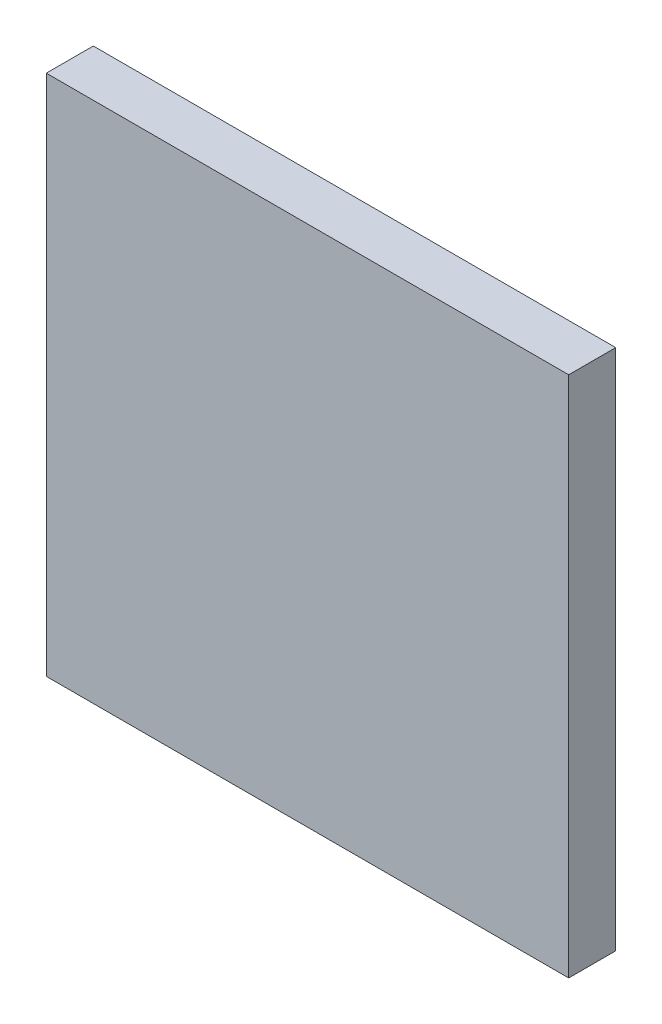
ISO-10303-21;
HEADER;
FILE_DESCRIPTION(('STEP AP214'),'2;1');
FILE_NAME('part.step','',(''),(''),'','','');
FILE_SCHEMA(('AUTOMOTIVE_DESIGN { 1 0 10303 214 1 1 1 1 }'));
ENDSEC;
DATA;
#1=APPLICATION_CONTEXT('core data for automotive mechanical design processes');
#2=APPLICATION_PROTOCOL_DEFINITION('international standard','automotive_design',2000,#1);
#3=PRODUCT_CONTEXT('',#1,'mechanical');
#4=PRODUCT('Part','Part','',(#3));
#5=PRODUCT_RELATED_PRODUCT_CATEGORY('part','',(#4));
#6=PRODUCT_DEFINITION_FORMATION('','',#4);
#7=PRODUCT_DEFINITION_CONTEXT('part definition',#1,'design');
#8=PRODUCT_DEFINITION('design','',#6,#7);
#9=PRODUCT_DEFINITION_SHAPE('','',#8);
#10=(LENGTH_UNIT() NAMED_UNIT(*) SI_UNIT(.MILLI.,.METRE.));
#11=(NAMED_UNIT(*) PLANE_ANGLE_UNIT() SI_UNIT($,.RADIAN.));
#12=(NAMED_UNIT(*) SI_UNIT($,.STERADIAN.) SOLID_ANGLE_UNIT());
#13=UNCERTAINTY_MEASURE_WITH_UNIT(LENGTH_MEASURE(1.E-05),#10,'distance_accuracy_value','');
#14=(GEOMETRIC_REPRESENTATION_CONTEXT(3) GLOBAL_UNCERTAINTY_ASSIGNED_CONTEXT((#13)) GLOBAL_UNIT_ASSIGNED_CONTEXT((#10,
#11,#12)) REPRESENTATION_CONTEXT('',''));
#15=CARTESIAN_POINT('',(0.,0.,0.));
#16=DIRECTION('',(0.,0.,1.));
#17=DIRECTION('',(1.,0.,0.));
#18=AXIS2_PLACEMENT_3D('',#15,#16,#17);
#19=CARTESIAN_POINT('',(5.,-5.,0.9));
#20=DIRECTION('',(-1.,0.,0.));
#21=DIRECTION('',(0.,0.,1.));
#22=AXIS2_PLACEMENT_3D('',#19,#20,#21);
#23=PLANE('',#22);
#24=DIRECTION('',(0.,1.,0.));
#25=VECTOR('',#24,1.);
#26=CARTESIAN_POINT('',(5.,-5.,0.));
#27=LINE('',#26,#25);
#28=CARTESIAN_POINT('',(5.,-5.,0.));
#29=VERTEX_POINT('',#28);
#30=CARTESIAN_POINT('',(5.,5.,0.));
#31=VERTEX_POINT('',#30);
#32=EDGE_CURVE('E98',#29,#31,#27,.T.);
#33=ORIENTED_EDGE('',*,*,#32,.T.);
#34=DIRECTION('',(0.,0.,-1.));
#35=VECTOR('',#34,1.);
#36=CARTESIAN_POINT('',(5.,5.,0.9));
#37=LINE('',#36,#35);
#38=CARTESIAN_POINT('',(5.,5.,0.9));
#39=VERTEX_POINT('',#38);
#40=EDGE_CURVE('E11',#39,#31,#37,.T.);
#41=ORIENTED_EDGE('',*,*,#40,.F.);
#42=DIRECTION('',(0.,1.,0.));
#43=VECTOR('',#42,1.);
#44=CARTESIAN_POINT('',(5.,-5.,0.9));
#45=LINE('',#44,#43);
#46=CARTESIAN_POINT('',(5.,-5.,0.9));
#47=VERTEX_POINT('',#46);
#48=EDGE_CURVE('E86',#47,#39,#45,.T.);
#49=ORIENTED_EDGE('',*,*,#48,.F.);
#50=DIRECTION('',(0.,0.,-1.));
#51=VECTOR('',#50,1.);
#52=CARTESIAN_POINT('',(5.,-5.,0.9));
#53=LINE('',#52,#51);
#54=EDGE_CURVE('E94',#47,#29,#53,.T.);
#55=ORIENTED_EDGE('',*,*,#54,.T.);
#56=EDGE_LOOP('',(#33,#41,#49,#55));
#57=FACE_BOUND('',#56,.T.);
#58=ADVANCED_FACE('F35',(#57),#23,.F.);
#59=CARTESIAN_POINT('',(-5.,5.,0.9));
#60=DIRECTION('',(0.,-1.,0.));
#61=DIRECTION('',(0.,0.,-1.));
#62=AXIS2_PLACEMENT_3D('',#59,#60,#61);
#63=PLANE('',#62);
#64=DIRECTION('',(-1.,0.,0.));
#65=VECTOR('',#64,1.);
#66=CARTESIAN_POINT('',(-5.,5.,0.));
#67=LINE('',#66,#65);
#68=CARTESIAN_POINT('',(-5.,5.,0.));
#69=VERTEX_POINT('',#68);
#70=EDGE_CURVE('E90',#31,#69,#67,.T.);
#71=ORIENTED_EDGE('',*,*,#70,.T.);
#72=DIRECTION('',(0.,0.,-1.));
#73=VECTOR('',#72,1.);
#74=CARTESIAN_POINT('',(-5.,5.,0.9));
#75=LINE('',#74,#73);
#76=CARTESIAN_POINT('',(-5.,5.,0.9));
#77=VERTEX_POINT('',#76);
#78=EDGE_CURVE('E43',#77,#69,#75,.T.);
#79=ORIENTED_EDGE('',*,*,#78,.F.);
#80=DIRECTION('',(-1.,0.,0.));
#81=VECTOR('',#80,1.);
#82=CARTESIAN_POINT('',(-5.,5.,0.9));
#83=LINE('',#82,#81);
#84=EDGE_CURVE('E81',#39,#77,#83,.T.);
#85=ORIENTED_EDGE('',*,*,#84,.F.);
#86=ORIENTED_EDGE('',*,*,#40,.T.);
#87=EDGE_LOOP('',(#71,#79,#85,#86));
#88=FACE_BOUND('',#87,.T.);
#89=ADVANCED_FACE('F89',(#88),#63,.F.);
#90=CARTESIAN_POINT('',(-5.,-5.,0.9));
#91=DIRECTION('',(1.,0.,0.));
#92=DIRECTION('',(0.,0.,-1.));
#93=AXIS2_PLACEMENT_3D('',#90,#91,#92);
#94=PLANE('',#93);
#95=DIRECTION('',(0.,-1.,0.));
#96=VECTOR('',#95,1.);
#97=CARTESIAN_POINT('',(-5.,-5.,0.));
#98=LINE('',#97,#96);
#99=CARTESIAN_POINT('',(-5.,-5.,0.));
#100=VERTEX_POINT('',#99);
#101=EDGE_CURVE('E68',#69,#100,#98,.T.);
#102=ORIENTED_EDGE('',*,*,#101,.T.);
#103=DIRECTION('',(0.,0.,-1.));
#104=VECTOR('',#103,1.);
#105=CARTESIAN_POINT('',(-5.,-5.,0.9));
#106=LINE('',#105,#104);
#107=CARTESIAN_POINT('',(-5.,-5.,0.9));
#108=VERTEX_POINT('',#107);
#109=EDGE_CURVE('E91',#108,#100,#106,.T.);
#110=ORIENTED_EDGE('',*,*,#109,.F.);
#111=DIRECTION('',(0.,-1.,0.));
#112=VECTOR('',#111,1.);
#113=CARTESIAN_POINT('',(-5.,-5.,0.9));
#114=LINE('',#113,#112);
#115=EDGE_CURVE('E84',#77,#108,#114,.T.);
#116=ORIENTED_EDGE('',*,*,#115,.F.);
#117=ORIENTED_EDGE('',*,*,#78,.T.);
#118=EDGE_LOOP('',(#102,#110,#116,#117));
#119=FACE_BOUND('',#118,.T.);
#120=ADVANCED_FACE('F92',(#119),#94,.F.);
#121=CARTESIAN_POINT('',(-5.,-5.,0.9));
#122=DIRECTION('',(0.,1.,0.));
#123=DIRECTION('',(0.,0.,1.));
#124=AXIS2_PLACEMENT_3D('',#121,#122,#123);
#125=PLANE('',#124);
#126=DIRECTION('',(1.,0.,0.));
#127=VECTOR('',#126,1.);
#128=CARTESIAN_POINT('',(-5.,-5.,0.));
#129=LINE('',#128,#127);
#130=EDGE_CURVE('E74',#100,#29,#129,.T.);
#131=ORIENTED_EDGE('',*,*,#130,.T.);
#132=ORIENTED_EDGE('',*,*,#54,.F.);
#133=DIRECTION('',(1.,0.,0.));
#134=VECTOR('',#133,1.);
#135=CARTESIAN_POINT('',(-5.,-5.,0.9));
#136=LINE('',#135,#134);
#137=EDGE_CURVE('E51',#108,#47,#136,.T.);
#138=ORIENTED_EDGE('',*,*,#137,.F.);
#139=ORIENTED_EDGE('',*,*,#109,.T.);
#140=EDGE_LOOP('',(#131,#132,#138,#139));
#141=FACE_BOUND('',#140,.T.);
#142=ADVANCED_FACE('F105',(#141),#125,.F.);
#143=CARTESIAN_POINT('',(0.,0.,0.9));
#144=DIRECTION('',(0.,0.,-1.));
#145=DIRECTION('',(-1.,0.,0.));
#146=AXIS2_PLACEMENT_3D('',#143,#144,#145);
#147=PLANE('',#146);
#148=ORIENTED_EDGE('',*,*,#48,.T.);
#149=ORIENTED_EDGE('',*,*,#84,.T.);
#150=ORIENTED_EDGE('',*,*,#115,.T.);
#151=ORIENTED_EDGE('',*,*,#137,.T.);
#152=EDGE_LOOP('',(#148,#149,#150,#151));
#153=FACE_BOUND('',#152,.T.);
#154=ADVANCED_FACE('F82',(#153),#147,.F.);
#155=CARTESIAN_POINT('',(0.,0.,0.));
#156=DIRECTION('',(0.,0.,-1.));
#157=DIRECTION('',(-1.,0.,0.));
#158=AXIS2_PLACEMENT_3D('',#155,#156,#157);
#159=PLANE('',#158);
#160=ORIENTED_EDGE('',*,*,#32,.F.);
#161=ORIENTED_EDGE('',*,*,#130,.F.);
#162=ORIENTED_EDGE('',*,*,#101,.F.);
#163=ORIENTED_EDGE('',*,*,#70,.F.);
#164=EDGE_LOOP('',(#160,#161,#162,#163));
#165=FACE_BOUND('',#164,.T.);
#166=ADVANCED_FACE('F108',(#165),#159,.T.);
#167=CLOSED_SHELL('',(#58,#89,#120,#142,#154,#166));
#168=MANIFOLD_SOLID_BREP('B2',#167);
#169=ADVANCED_BREP_SHAPE_REPRESENTATION('',(#18,#168),#14);
#170=SHAPE_DEFINITION_REPRESENTATION(#9,#169);
ENDSEC;
END-ISO-10303-21;
